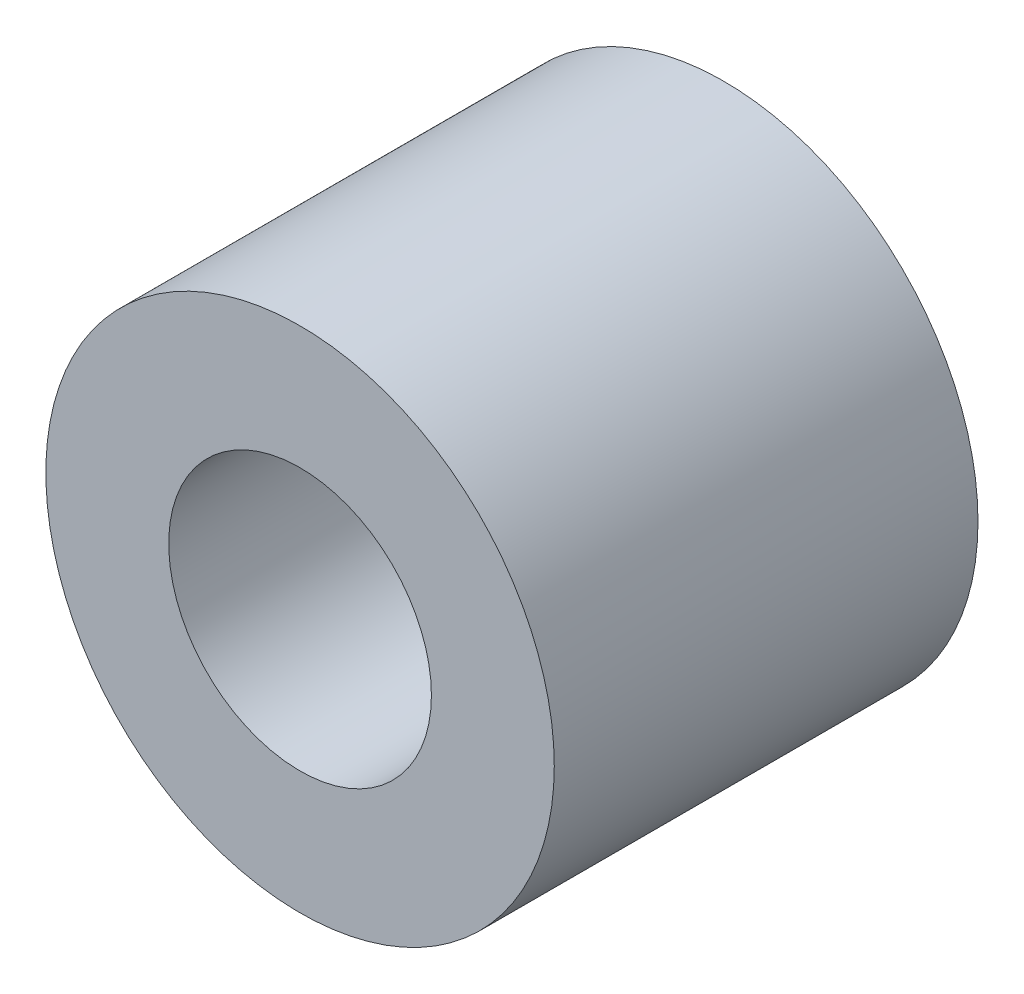
ISO-10303-21;
HEADER;
FILE_DESCRIPTION(('STEP AP214'),'2;1');
FILE_NAME('part.step','',(''),(''),'','','');
FILE_SCHEMA(('AUTOMOTIVE_DESIGN { 1 0 10303 214 1 1 1 1 }'));
ENDSEC;
DATA;
#1=APPLICATION_CONTEXT('core data for automotive mechanical design processes');
#2=APPLICATION_PROTOCOL_DEFINITION('international standard','automotive_design',2000,#1);
#3=PRODUCT_CONTEXT('',#1,'mechanical');
#4=PRODUCT('Part','Part','',(#3));
#5=PRODUCT_RELATED_PRODUCT_CATEGORY('part','',(#4));
#6=PRODUCT_DEFINITION_FORMATION('','',#4);
#7=PRODUCT_DEFINITION_CONTEXT('part definition',#1,'design');
#8=PRODUCT_DEFINITION('design','',#6,#7);
#9=PRODUCT_DEFINITION_SHAPE('','',#8);
#10=(LENGTH_UNIT() NAMED_UNIT(*) SI_UNIT(.MILLI.,.METRE.));
#11=(NAMED_UNIT(*) PLANE_ANGLE_UNIT() SI_UNIT($,.RADIAN.));
#12=(NAMED_UNIT(*) SI_UNIT($,.STERADIAN.) SOLID_ANGLE_UNIT());
#13=UNCERTAINTY_MEASURE_WITH_UNIT(LENGTH_MEASURE(1.E-05),#10,'distance_accuracy_value','');
#14=(GEOMETRIC_REPRESENTATION_CONTEXT(3) GLOBAL_UNCERTAINTY_ASSIGNED_CONTEXT((#13)) GLOBAL_UNIT_ASSIGNED_CONTEXT((#10,
#11,#12)) REPRESENTATION_CONTEXT('',''));
#15=CARTESIAN_POINT('',(0.,0.,0.));
#16=DIRECTION('',(0.,0.,1.));
#17=DIRECTION('',(1.,0.,0.));
#18=AXIS2_PLACEMENT_3D('',#15,#16,#17);
#19=CARTESIAN_POINT('',(0.,0.407753572367607,5.));
#20=DIRECTION('',(0.,0.,1.));
#21=DIRECTION('',(1.,0.,0.));
#22=AXIS2_PLACEMENT_3D('',#19,#20,#21);
#23=PLANE('',#22);
#24=CARTESIAN_POINT('',(0.,0.407753572367607,5.));
#25=DIRECTION('',(0.,0.,1.));
#26=DIRECTION('',(1.,0.,0.));
#27=AXIS2_PLACEMENT_3D('',#24,#25,#26);
#28=CIRCLE('',#27,3.);
#29=CARTESIAN_POINT('',(3.,0.407753572367607,5.));
#30=VERTEX_POINT('',#29);
#31=EDGE_CURVE('E10',#30,#30,#28,.T.);
#32=ORIENTED_EDGE('',*,*,#31,.T.);
#33=EDGE_LOOP('',(#32));
#34=FACE_BOUND('',#33,.T.);
#35=CARTESIAN_POINT('',(0.,0.407753572367607,5.));
#36=DIRECTION('',(0.,0.,1.));
#37=DIRECTION('',(1.,0.,0.));
#38=AXIS2_PLACEMENT_3D('',#35,#36,#37);
#39=CIRCLE('',#38,1.55);
#40=CARTESIAN_POINT('',(1.55,0.407753572367607,5.));
#41=VERTEX_POINT('',#40);
#42=EDGE_CURVE('E42',#41,#41,#39,.T.);
#43=ORIENTED_EDGE('',*,*,#42,.F.);
#44=EDGE_LOOP('',(#43));
#45=FACE_BOUND('',#44,.T.);
#46=ADVANCED_FACE('F31',(#34,#45),#23,.T.);
#47=CARTESIAN_POINT('',(0.,0.407753572367607,0.));
#48=DIRECTION('',(0.,0.,1.));
#49=DIRECTION('',(1.,0.,0.));
#50=AXIS2_PLACEMENT_3D('',#47,#48,#49);
#51=PLANE('',#50);
#52=CARTESIAN_POINT('',(0.,0.407753572367607,0.));
#53=DIRECTION('',(0.,0.,1.));
#54=DIRECTION('',(1.,0.,0.));
#55=AXIS2_PLACEMENT_3D('',#52,#53,#54);
#56=CIRCLE('',#55,3.);
#57=CARTESIAN_POINT('',(3.,0.407753572367607,0.));
#58=VERTEX_POINT('',#57);
#59=EDGE_CURVE('E35',#58,#58,#56,.T.);
#60=ORIENTED_EDGE('',*,*,#59,.F.);
#61=EDGE_LOOP('',(#60));
#62=FACE_BOUND('',#61,.T.);
#63=CARTESIAN_POINT('',(0.,0.407753572367607,0.));
#64=DIRECTION('',(0.,0.,1.));
#65=DIRECTION('',(1.,0.,0.));
#66=AXIS2_PLACEMENT_3D('',#63,#64,#65);
#67=CIRCLE('',#66,1.55);
#68=CARTESIAN_POINT('',(1.55,0.407753572367607,0.));
#69=VERTEX_POINT('',#68);
#70=EDGE_CURVE('E44',#69,#69,#67,.T.);
#71=ORIENTED_EDGE('',*,*,#70,.T.);
#72=EDGE_LOOP('',(#71));
#73=FACE_BOUND('',#72,.T.);
#74=ADVANCED_FACE('F54',(#62,#73),#51,.F.);
#75=CARTESIAN_POINT('',(0.,0.407753572367607,5.));
#76=DIRECTION('',(0.,0.,-1.));
#77=DIRECTION('',(-1.,0.,0.));
#78=AXIS2_PLACEMENT_3D('',#75,#76,#77);
#79=CYLINDRICAL_SURFACE('',#78,3.);
#80=ORIENTED_EDGE('',*,*,#31,.F.);
#81=EDGE_LOOP('',(#80));
#82=FACE_BOUND('',#81,.T.);
#83=ORIENTED_EDGE('',*,*,#59,.T.);
#84=EDGE_LOOP('',(#83));
#85=FACE_BOUND('',#84,.T.);
#86=ADVANCED_FACE('F33',(#82,#85),#79,.T.);
#87=CARTESIAN_POINT('',(0.,0.407753572367607,5.));
#88=DIRECTION('',(0.,0.,-1.));
#89=DIRECTION('',(-1.,0.,0.));
#90=AXIS2_PLACEMENT_3D('',#87,#88,#89);
#91=CYLINDRICAL_SURFACE('',#90,1.55);
#92=ORIENTED_EDGE('',*,*,#42,.T.);
#93=EDGE_LOOP('',(#92));
#94=FACE_BOUND('',#93,.T.);
#95=ORIENTED_EDGE('',*,*,#70,.F.);
#96=EDGE_LOOP('',(#95));
#97=FACE_BOUND('',#96,.T.);
#98=ADVANCED_FACE('F50',(#94,#97),#91,.F.);
#99=CLOSED_SHELL('',(#46,#74,#86,#98));
#100=MANIFOLD_SOLID_BREP('B2',#99);
#101=ADVANCED_BREP_SHAPE_REPRESENTATION('',(#18,#100),#14);
#102=SHAPE_DEFINITION_REPRESENTATION(#9,#101);
ENDSEC;
END-ISO-10303-21;
